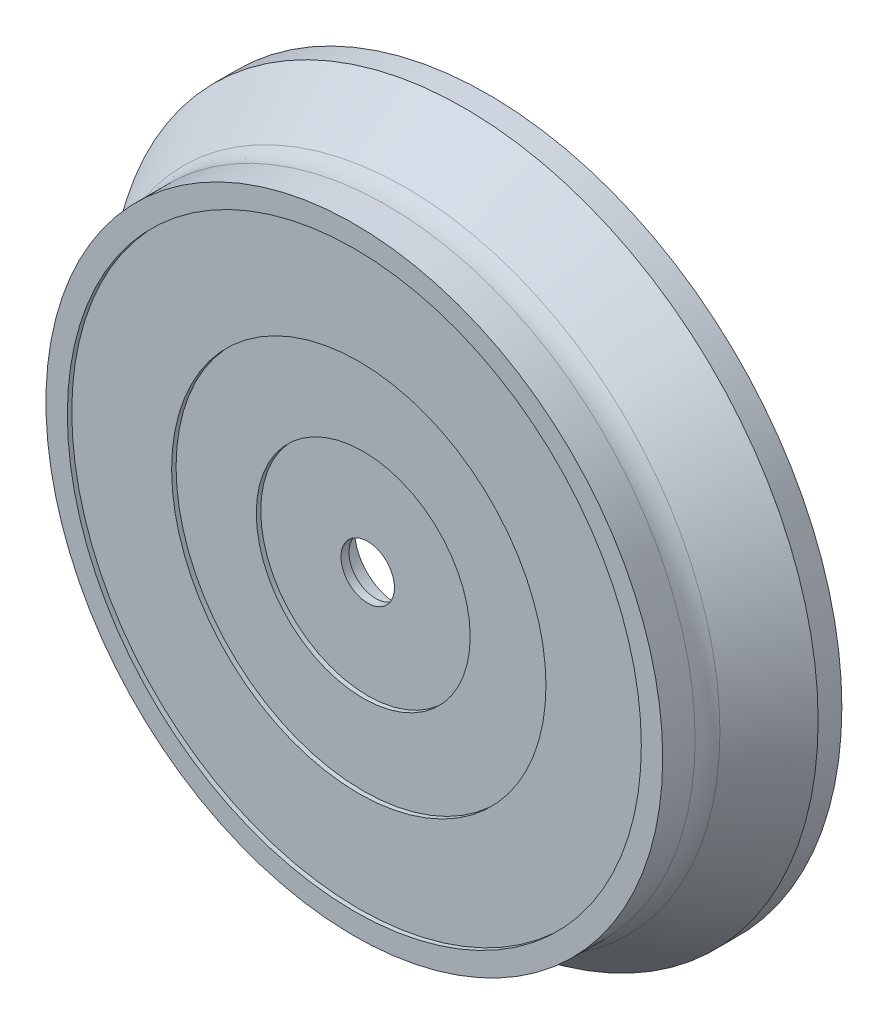
ISO-10303-21;
HEADER;
FILE_DESCRIPTION(('STEP AP214'),'2;1');
FILE_NAME('part.step','',(''),(''),'','','');
FILE_SCHEMA(('AUTOMOTIVE_DESIGN { 1 0 10303 214 1 1 1 1 }'));
ENDSEC;
DATA;
#1=APPLICATION_CONTEXT('core data for automotive mechanical design processes');
#2=APPLICATION_PROTOCOL_DEFINITION('international standard','automotive_design',2000,#1);
#3=PRODUCT_CONTEXT('',#1,'mechanical');
#4=PRODUCT('Part','Part','',(#3));
#5=PRODUCT_RELATED_PRODUCT_CATEGORY('part','',(#4));
#6=PRODUCT_DEFINITION_FORMATION('','',#4);
#7=PRODUCT_DEFINITION_CONTEXT('part definition',#1,'design');
#8=PRODUCT_DEFINITION('design','',#6,#7);
#9=PRODUCT_DEFINITION_SHAPE('','',#8);
#10=(LENGTH_UNIT() NAMED_UNIT(*) SI_UNIT(.MILLI.,.METRE.));
#11=(NAMED_UNIT(*) PLANE_ANGLE_UNIT() SI_UNIT($,.RADIAN.));
#12=(NAMED_UNIT(*) SI_UNIT($,.STERADIAN.) SOLID_ANGLE_UNIT());
#13=UNCERTAINTY_MEASURE_WITH_UNIT(LENGTH_MEASURE(1.E-05),#10,'distance_accuracy_value','');
#14=(GEOMETRIC_REPRESENTATION_CONTEXT(3) GLOBAL_UNCERTAINTY_ASSIGNED_CONTEXT((#13)) GLOBAL_UNIT_ASSIGNED_CONTEXT((#10,
#11,#12)) REPRESENTATION_CONTEXT('',''));
#15=CARTESIAN_POINT('',(0.,0.,0.));
#16=DIRECTION('',(0.,0.,1.));
#17=DIRECTION('',(1.,0.,0.));
#18=AXIS2_PLACEMENT_3D('',#15,#16,#17);
#19=CARTESIAN_POINT('',(0.,0.,55.));
#20=DIRECTION('',(0.,0.,1.));
#21=DIRECTION('',(1.,0.,0.));
#22=AXIS2_PLACEMENT_3D('',#19,#20,#21);
#23=CYLINDRICAL_SURFACE('',#22,115.334);
#24=CARTESIAN_POINT('',(0.,0.,-12.107863300215));
#25=DIRECTION('',(0.,0.,1.));
#26=DIRECTION('',(1.,0.,0.));
#27=AXIS2_PLACEMENT_3D('',#24,#25,#26);
#28=CIRCLE('',#27,115.334);
#29=CARTESIAN_POINT('',(115.334,0.,-12.107863300215));
#30=VERTEX_POINT('',#29);
#31=EDGE_CURVE('E10',#30,#30,#28,.T.);
#32=ORIENTED_EDGE('',*,*,#31,.T.);
#33=EDGE_LOOP('',(#32));
#34=FACE_BOUND('',#33,.T.);
#35=CARTESIAN_POINT('',(0.,0.,0.));
#36=DIRECTION('',(0.,0.,1.));
#37=DIRECTION('',(1.,0.,0.));
#38=AXIS2_PLACEMENT_3D('',#35,#36,#37);
#39=CIRCLE('',#38,115.334);
#40=CARTESIAN_POINT('',(115.334,0.,0.));
#41=VERTEX_POINT('',#40);
#42=EDGE_CURVE('E92',#41,#41,#39,.T.);
#43=ORIENTED_EDGE('',*,*,#42,.F.);
#44=EDGE_LOOP('',(#43));
#45=FACE_BOUND('',#44,.T.);
#46=ADVANCED_FACE('F40',(#34,#45),#23,.T.);
#47=CARTESIAN_POINT('',(0.,0.,-12.107863300215));
#48=DIRECTION('',(0.,0.,1.));
#49=DIRECTION('',(1.,0.,0.));
#50=AXIS2_PLACEMENT_3D('',#47,#48,#49);
#51=TOROIDAL_SURFACE('',#50,128.034,12.7);
#52=CARTESIAN_POINT('',(0.,0.,-19.2237922700585));
#53=DIRECTION('',(0.,0.,1.));
#54=DIRECTION('',(1.,0.,0.));
#55=AXIS2_PLACEMENT_3D('',#52,#53,#54);
#56=CIRCLE('',#55,117.514800653275);
#57=CARTESIAN_POINT('',(117.514800653275,0.,-19.2237922700585));
#58=VERTEX_POINT('',#57);
#59=EDGE_CURVE('E43',#58,#58,#56,.T.);
#60=ORIENTED_EDGE('',*,*,#59,.T.);
#61=EDGE_LOOP('',(#60));
#62=FACE_BOUND('',#61,.T.);
#63=ORIENTED_EDGE('',*,*,#31,.F.);
#64=EDGE_LOOP('',(#63));
#65=FACE_BOUND('',#64,.T.);
#66=ADVANCED_FACE('F100',(#62,#65),#51,.F.);
#67=CARTESIAN_POINT('',(0.,0.,-19.2237922700585));
#68=DIRECTION('',(0.,0.,-1.));
#69=DIRECTION('',(-1.,0.,0.));
#70=AXIS2_PLACEMENT_3D('',#67,#68,#69);
#71=CONICAL_SURFACE('',#70,117.514800653275,0.594759257483352);
#72=CARTESIAN_POINT('',(0.,0.,-41.1304347826087));
#73=DIRECTION('',(0.,0.,1.));
#74=DIRECTION('',(1.,0.,0.));
#75=AXIS2_PLACEMENT_3D('',#72,#73,#74);
#76=CIRCLE('',#75,132.334);
#77=CARTESIAN_POINT('',(132.334,0.,-41.1304347826087));
#78=VERTEX_POINT('',#77);
#79=EDGE_CURVE('E50',#78,#78,#76,.T.);
#80=ORIENTED_EDGE('',*,*,#79,.T.);
#81=EDGE_LOOP('',(#80));
#82=FACE_BOUND('',#81,.T.);
#83=ORIENTED_EDGE('',*,*,#59,.F.);
#84=EDGE_LOOP('',(#83));
#85=FACE_BOUND('',#84,.T.);
#86=ADVANCED_FACE('F101',(#82,#85),#71,.T.);
#87=CARTESIAN_POINT('',(0.,0.,55.));
#88=DIRECTION('',(0.,0.,1.));
#89=DIRECTION('',(1.,0.,0.));
#90=AXIS2_PLACEMENT_3D('',#87,#88,#89);
#91=CYLINDRICAL_SURFACE('',#90,132.334);
#92=ORIENTED_EDGE('',*,*,#79,.F.);
#93=EDGE_LOOP('',(#92));
#94=FACE_BOUND('',#93,.T.);
#95=CARTESIAN_POINT('',(0.,0.,-50.));
#96=DIRECTION('',(0.,0.,1.));
#97=DIRECTION('',(1.,0.,0.));
#98=AXIS2_PLACEMENT_3D('',#95,#96,#97);
#99=CIRCLE('',#98,132.334);
#100=CARTESIAN_POINT('',(132.334,0.,-50.));
#101=VERTEX_POINT('',#100);
#102=EDGE_CURVE('E51',#101,#101,#99,.T.);
#103=ORIENTED_EDGE('',*,*,#102,.T.);
#104=EDGE_LOOP('',(#103));
#105=FACE_BOUND('',#104,.T.);
#106=ADVANCED_FACE('F110',(#94,#105),#91,.T.);
#107=CARTESIAN_POINT('',(0.,0.,-50.));
#108=DIRECTION('',(0.,0.,1.));
#109=DIRECTION('',(1.,0.,0.));
#110=AXIS2_PLACEMENT_3D('',#107,#108,#109);
#111=PLANE('',#110);
#112=ORIENTED_EDGE('',*,*,#102,.F.);
#113=EDGE_LOOP('',(#112));
#114=FACE_BOUND('',#113,.T.);
#115=CARTESIAN_POINT('',(0.,0.,-50.));
#116=DIRECTION('',(0.,0.,1.));
#117=DIRECTION('',(1.,0.,0.));
#118=AXIS2_PLACEMENT_3D('',#115,#116,#117);
#119=CIRCLE('',#118,130.334);
#120=CARTESIAN_POINT('',(130.334,0.,-50.));
#121=VERTEX_POINT('',#120);
#122=EDGE_CURVE('E57',#121,#121,#119,.T.);
#123=ORIENTED_EDGE('',*,*,#122,.T.);
#124=EDGE_LOOP('',(#123));
#125=FACE_BOUND('',#124,.T.);
#126=ADVANCED_FACE('F112',(#114,#125),#111,.F.);
#127=CARTESIAN_POINT('',(0.,0.,-16.));
#128=DIRECTION('',(0.,0.,-1.));
#129=DIRECTION('',(-1.,0.,0.));
#130=AXIS2_PLACEMENT_3D('',#127,#128,#129);
#131=CONICAL_SURFACE('',#130,107.334,0.594759257483353);
#132=ORIENTED_EDGE('',*,*,#122,.F.);
#133=EDGE_LOOP('',(#132));
#134=FACE_BOUND('',#133,.T.);
#135=CARTESIAN_POINT('',(0.,0.,-16.));
#136=DIRECTION('',(0.,0.,1.));
#137=DIRECTION('',(1.,0.,0.));
#138=AXIS2_PLACEMENT_3D('',#135,#136,#137);
#139=CIRCLE('',#138,107.334);
#140=CARTESIAN_POINT('',(107.334,0.,-16.));
#141=VERTEX_POINT('',#140);
#142=EDGE_CURVE('E56',#141,#141,#139,.T.);
#143=ORIENTED_EDGE('',*,*,#142,.T.);
#144=EDGE_LOOP('',(#143));
#145=FACE_BOUND('',#144,.T.);
#146=ADVANCED_FACE('F117',(#134,#145),#131,.F.);
#147=CARTESIAN_POINT('',(0.,0.,-16.));
#148=DIRECTION('',(0.,0.,1.));
#149=DIRECTION('',(1.,0.,0.));
#150=AXIS2_PLACEMENT_3D('',#147,#148,#149);
#151=PLANE('',#150);
#152=ORIENTED_EDGE('',*,*,#142,.F.);
#153=EDGE_LOOP('',(#152));
#154=FACE_BOUND('',#153,.T.);
#155=CARTESIAN_POINT('',(0.,0.,-16.));
#156=DIRECTION('',(0.,0.,1.));
#157=DIRECTION('',(1.,0.,0.));
#158=AXIS2_PLACEMENT_3D('',#155,#156,#157);
#159=CIRCLE('',#158,15.875);
#160=CARTESIAN_POINT('',(15.875,0.,-16.));
#161=VERTEX_POINT('',#160);
#162=EDGE_CURVE('E65',#161,#161,#159,.T.);
#163=ORIENTED_EDGE('',*,*,#162,.T.);
#164=EDGE_LOOP('',(#163));
#165=FACE_BOUND('',#164,.T.);
#166=ADVANCED_FACE('F125',(#154,#165),#151,.F.);
#167=CARTESIAN_POINT('',(0.,0.,55.));
#168=DIRECTION('',(0.,0.,1.));
#169=DIRECTION('',(1.,0.,0.));
#170=AXIS2_PLACEMENT_3D('',#167,#168,#169);
#171=CYLINDRICAL_SURFACE('',#170,15.875);
#172=ORIENTED_EDGE('',*,*,#162,.F.);
#173=EDGE_LOOP('',(#172));
#174=FACE_BOUND('',#173,.T.);
#175=CARTESIAN_POINT('',(0.,0.,-7.99999999999998));
#176=DIRECTION('',(0.,0.,1.));
#177=DIRECTION('',(1.,0.,0.));
#178=AXIS2_PLACEMENT_3D('',#175,#176,#177);
#179=CIRCLE('',#178,15.875);
#180=CARTESIAN_POINT('',(15.875,0.,-7.99999999999998));
#181=VERTEX_POINT('',#180);
#182=EDGE_CURVE('E63',#181,#181,#179,.T.);
#183=ORIENTED_EDGE('',*,*,#182,.T.);
#184=EDGE_LOOP('',(#183));
#185=FACE_BOUND('',#184,.T.);
#186=ADVANCED_FACE('F127',(#174,#185),#171,.F.);
#187=CARTESIAN_POINT('',(0.,0.,-7.99999999999998));
#188=DIRECTION('',(0.,0.,1.));
#189=DIRECTION('',(1.,0.,0.));
#190=AXIS2_PLACEMENT_3D('',#187,#188,#189);
#191=PLANE('',#190);
#192=ORIENTED_EDGE('',*,*,#182,.F.);
#193=EDGE_LOOP('',(#192));
#194=FACE_BOUND('',#193,.T.);
#195=CARTESIAN_POINT('',(0.,0.,-7.99999999999998));
#196=DIRECTION('',(0.,0.,1.));
#197=DIRECTION('',(1.,0.,0.));
#198=AXIS2_PLACEMENT_3D('',#195,#196,#197);
#199=CIRCLE('',#198,10.);
#200=CARTESIAN_POINT('',(10.,0.,-7.99999999999998));
#201=VERTEX_POINT('',#200);
#202=EDGE_CURVE('E67',#201,#201,#199,.T.);
#203=ORIENTED_EDGE('',*,*,#202,.T.);
#204=EDGE_LOOP('',(#203));
#205=FACE_BOUND('',#204,.T.);
#206=ADVANCED_FACE('F128',(#194,#205),#191,.F.);
#207=CARTESIAN_POINT('',(0.,0.,55.));
#208=DIRECTION('',(0.,0.,1.));
#209=DIRECTION('',(1.,0.,0.));
#210=AXIS2_PLACEMENT_3D('',#207,#208,#209);
#211=CYLINDRICAL_SURFACE('',#210,10.);
#212=ORIENTED_EDGE('',*,*,#202,.F.);
#213=EDGE_LOOP('',(#212));
#214=FACE_BOUND('',#213,.T.);
#215=CARTESIAN_POINT('',(0.,0.,-4.99999999999998));
#216=DIRECTION('',(0.,0.,1.));
#217=DIRECTION('',(1.,0.,0.));
#218=AXIS2_PLACEMENT_3D('',#215,#216,#217);
#219=CIRCLE('',#218,10.);
#220=CARTESIAN_POINT('',(10.,0.,-4.99999999999998));
#221=VERTEX_POINT('',#220);
#222=EDGE_CURVE('E71',#221,#221,#219,.T.);
#223=ORIENTED_EDGE('',*,*,#222,.T.);
#224=EDGE_LOOP('',(#223));
#225=FACE_BOUND('',#224,.T.);
#226=ADVANCED_FACE('F135',(#214,#225),#211,.F.);
#227=CARTESIAN_POINT('',(0.,0.,-4.99999999999999));
#228=DIRECTION('',(0.,0.,-1.));
#229=DIRECTION('',(-1.,0.,0.));
#230=AXIS2_PLACEMENT_3D('',#227,#228,#229);
#231=PLANE('',#230);
#232=ORIENTED_EDGE('',*,*,#222,.F.);
#233=EDGE_LOOP('',(#232));
#234=FACE_BOUND('',#233,.T.);
#235=CARTESIAN_POINT('',(0.,0.,-5.));
#236=DIRECTION('',(0.,0.,1.));
#237=DIRECTION('',(1.,0.,0.));
#238=AXIS2_PLACEMENT_3D('',#235,#236,#237);
#239=CIRCLE('',#238,40.);
#240=CARTESIAN_POINT('',(40.,0.,-5.));
#241=VERTEX_POINT('',#240);
#242=EDGE_CURVE('E73',#241,#241,#239,.T.);
#243=ORIENTED_EDGE('',*,*,#242,.T.);
#244=EDGE_LOOP('',(#243));
#245=FACE_BOUND('',#244,.T.);
#246=ADVANCED_FACE('F139',(#234,#245),#231,.F.);
#247=CARTESIAN_POINT('',(0.,0.,55.));
#248=DIRECTION('',(0.,0.,1.));
#249=DIRECTION('',(1.,0.,0.));
#250=AXIS2_PLACEMENT_3D('',#247,#248,#249);
#251=CYLINDRICAL_SURFACE('',#250,40.);
#252=ORIENTED_EDGE('',*,*,#242,.F.);
#253=EDGE_LOOP('',(#252));
#254=FACE_BOUND('',#253,.T.);
#255=CARTESIAN_POINT('',(0.,0.,-3.33333333333333));
#256=DIRECTION('',(0.,0.,1.));
#257=DIRECTION('',(1.,0.,0.));
#258=AXIS2_PLACEMENT_3D('',#255,#256,#257);
#259=CIRCLE('',#258,40.);
#260=CARTESIAN_POINT('',(40.,0.,-3.33333333333333));
#261=VERTEX_POINT('',#260);
#262=EDGE_CURVE('E80',#261,#261,#259,.T.);
#263=ORIENTED_EDGE('',*,*,#262,.T.);
#264=EDGE_LOOP('',(#263));
#265=FACE_BOUND('',#264,.T.);
#266=ADVANCED_FACE('F145',(#254,#265),#251,.F.);
#267=CARTESIAN_POINT('',(0.,0.,-3.33333333333333));
#268=DIRECTION('',(0.,0.,-1.));
#269=DIRECTION('',(-1.,0.,0.));
#270=AXIS2_PLACEMENT_3D('',#267,#268,#269);
#271=PLANE('',#270);
#272=ORIENTED_EDGE('',*,*,#262,.F.);
#273=EDGE_LOOP('',(#272));
#274=FACE_BOUND('',#273,.T.);
#275=CARTESIAN_POINT('',(0.,0.,-3.33333333333333));
#276=DIRECTION('',(0.,0.,1.));
#277=DIRECTION('',(1.,0.,0.));
#278=AXIS2_PLACEMENT_3D('',#275,#276,#277);
#279=CIRCLE('',#278,70.);
#280=CARTESIAN_POINT('',(70.,0.,-3.33333333333333));
#281=VERTEX_POINT('',#280);
#282=EDGE_CURVE('E78',#281,#281,#279,.T.);
#283=ORIENTED_EDGE('',*,*,#282,.T.);
#284=EDGE_LOOP('',(#283));
#285=FACE_BOUND('',#284,.T.);
#286=ADVANCED_FACE('F147',(#274,#285),#271,.F.);
#287=CARTESIAN_POINT('',(0.,0.,55.));
#288=DIRECTION('',(0.,0.,1.));
#289=DIRECTION('',(1.,0.,0.));
#290=AXIS2_PLACEMENT_3D('',#287,#288,#289);
#291=CYLINDRICAL_SURFACE('',#290,70.);
#292=ORIENTED_EDGE('',*,*,#282,.F.);
#293=EDGE_LOOP('',(#292));
#294=FACE_BOUND('',#293,.T.);
#295=CARTESIAN_POINT('',(0.,0.,-1.66666666666666));
#296=DIRECTION('',(0.,0.,1.));
#297=DIRECTION('',(1.,0.,0.));
#298=AXIS2_PLACEMENT_3D('',#295,#296,#297);
#299=CIRCLE('',#298,70.);
#300=CARTESIAN_POINT('',(70.,0.,-1.66666666666666));
#301=VERTEX_POINT('',#300);
#302=EDGE_CURVE('E84',#301,#301,#299,.T.);
#303=ORIENTED_EDGE('',*,*,#302,.T.);
#304=EDGE_LOOP('',(#303));
#305=FACE_BOUND('',#304,.T.);
#306=ADVANCED_FACE('F148',(#294,#305),#291,.F.);
#307=CARTESIAN_POINT('',(0.,0.,-1.66666666666667));
#308=DIRECTION('',(0.,0.,-1.));
#309=DIRECTION('',(-1.,0.,0.));
#310=AXIS2_PLACEMENT_3D('',#307,#308,#309);
#311=PLANE('',#310);
#312=ORIENTED_EDGE('',*,*,#302,.F.);
#313=EDGE_LOOP('',(#312));
#314=FACE_BOUND('',#313,.T.);
#315=CARTESIAN_POINT('',(0.,0.,-1.66666666666667));
#316=DIRECTION('',(0.,0.,1.));
#317=DIRECTION('',(1.,0.,0.));
#318=AXIS2_PLACEMENT_3D('',#315,#316,#317);
#319=CIRCLE('',#318,107.334);
#320=CARTESIAN_POINT('',(107.334,0.,-1.66666666666667));
#321=VERTEX_POINT('',#320);
#322=EDGE_CURVE('E88',#321,#321,#319,.T.);
#323=ORIENTED_EDGE('',*,*,#322,.T.);
#324=EDGE_LOOP('',(#323));
#325=FACE_BOUND('',#324,.T.);
#326=ADVANCED_FACE('F155',(#314,#325),#311,.F.);
#327=CARTESIAN_POINT('',(0.,0.,55.));
#328=DIRECTION('',(0.,0.,1.));
#329=DIRECTION('',(1.,0.,0.));
#330=AXIS2_PLACEMENT_3D('',#327,#328,#329);
#331=CYLINDRICAL_SURFACE('',#330,107.334);
#332=ORIENTED_EDGE('',*,*,#322,.F.);
#333=EDGE_LOOP('',(#332));
#334=FACE_BOUND('',#333,.T.);
#335=CARTESIAN_POINT('',(0.,0.,0.));
#336=DIRECTION('',(0.,0.,1.));
#337=DIRECTION('',(1.,0.,0.));
#338=AXIS2_PLACEMENT_3D('',#335,#336,#337);
#339=CIRCLE('',#338,107.334);
#340=CARTESIAN_POINT('',(107.334,0.,0.));
#341=VERTEX_POINT('',#340);
#342=EDGE_CURVE('E90',#341,#341,#339,.T.);
#343=ORIENTED_EDGE('',*,*,#342,.T.);
#344=EDGE_LOOP('',(#343));
#345=FACE_BOUND('',#344,.T.);
#346=ADVANCED_FACE('F159',(#334,#345),#331,.F.);
#347=CARTESIAN_POINT('',(0.,0.,0.));
#348=DIRECTION('',(0.,0.,-1.));
#349=DIRECTION('',(-1.,0.,0.));
#350=AXIS2_PLACEMENT_3D('',#347,#348,#349);
#351=PLANE('',#350);
#352=ORIENTED_EDGE('',*,*,#342,.F.);
#353=EDGE_LOOP('',(#352));
#354=FACE_BOUND('',#353,.T.);
#355=ORIENTED_EDGE('',*,*,#42,.T.);
#356=EDGE_LOOP('',(#355));
#357=FACE_BOUND('',#356,.T.);
#358=ADVANCED_FACE('F98',(#354,#357),#351,.F.);
#359=CLOSED_SHELL('',(#46,#66,#86,#106,#126,#146,#166,#186,#206,#226,#246,#266,#286,#306,#326,
#346,#358));
#360=MANIFOLD_SOLID_BREP('B2',#359);
#361=ADVANCED_BREP_SHAPE_REPRESENTATION('',(#18,#360),#14);
#362=SHAPE_DEFINITION_REPRESENTATION(#9,#361);
ENDSEC;
END-ISO-10303-21;
